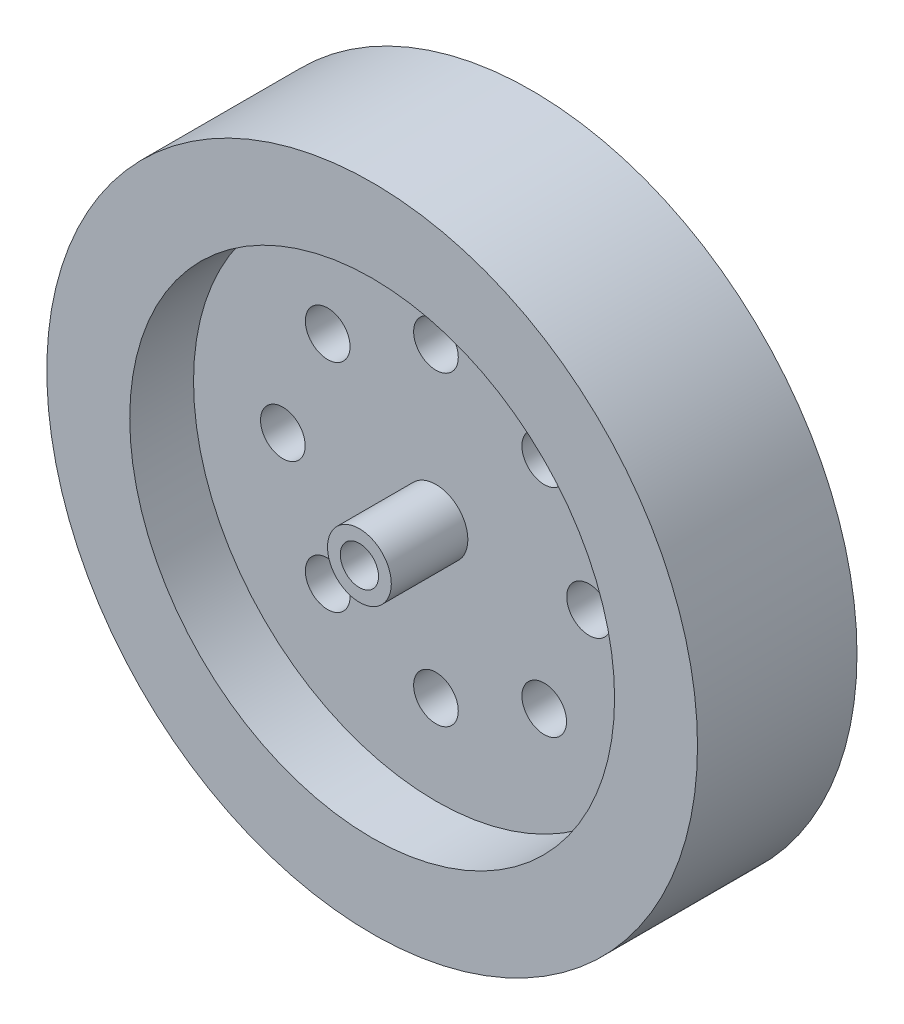
ISO-10303-21;
HEADER;
FILE_DESCRIPTION(('STEP AP214'),'2;1');
FILE_NAME('part.step','',(''),(''),'','','');
FILE_SCHEMA(('AUTOMOTIVE_DESIGN { 1 0 10303 214 1 1 1 1 }'));
ENDSEC;
DATA;
#1=APPLICATION_CONTEXT('core data for automotive mechanical design processes');
#2=APPLICATION_PROTOCOL_DEFINITION('international standard','automotive_design',2000,#1);
#3=PRODUCT_CONTEXT('',#1,'mechanical');
#4=PRODUCT('Part','Part','',(#3));
#5=PRODUCT_RELATED_PRODUCT_CATEGORY('part','',(#4));
#6=PRODUCT_DEFINITION_FORMATION('','',#4);
#7=PRODUCT_DEFINITION_CONTEXT('part definition',#1,'design');
#8=PRODUCT_DEFINITION('design','',#6,#7);
#9=PRODUCT_DEFINITION_SHAPE('','',#8);
#10=(LENGTH_UNIT() NAMED_UNIT(*) SI_UNIT(.MILLI.,.METRE.));
#11=(NAMED_UNIT(*) PLANE_ANGLE_UNIT() SI_UNIT($,.RADIAN.));
#12=(NAMED_UNIT(*) SI_UNIT($,.STERADIAN.) SOLID_ANGLE_UNIT());
#13=UNCERTAINTY_MEASURE_WITH_UNIT(LENGTH_MEASURE(1.E-05),#10,'distance_accuracy_value','');
#14=(GEOMETRIC_REPRESENTATION_CONTEXT(3) GLOBAL_UNCERTAINTY_ASSIGNED_CONTEXT((#13)) GLOBAL_UNIT_ASSIGNED_CONTEXT((#10,
#11,#12)) REPRESENTATION_CONTEXT('',''));
#15=CARTESIAN_POINT('',(0.,0.,0.));
#16=DIRECTION('',(0.,0.,1.));
#17=DIRECTION('',(1.,0.,0.));
#18=AXIS2_PLACEMENT_3D('',#15,#16,#17);
#19=CARTESIAN_POINT('',(-16.9705627484765,16.9705627484757,-25.));
#20=DIRECTION('',(0.,0.,1.));
#21=DIRECTION('',(1.,0.,0.));
#22=AXIS2_PLACEMENT_3D('',#19,#20,#21);
#23=CYLINDRICAL_SURFACE('',#22,3.50000000000128);
#24=CARTESIAN_POINT('',(-16.9705627484765,16.9705627484757,-15.));
#25=DIRECTION('',(0.,0.,1.));
#26=DIRECTION('',(1.,0.,0.));
#27=AXIS2_PLACEMENT_3D('',#24,#25,#26);
#28=CIRCLE('',#27,3.50000000000128);
#29=CARTESIAN_POINT('',(-13.4705627484753,16.9705627484757,-15.));
#30=VERTEX_POINT('',#29);
#31=EDGE_CURVE('E81',#30,#30,#28,.F.);
#32=ORIENTED_EDGE('',*,*,#31,.T.);
#33=EDGE_LOOP('',(#32));
#34=FACE_BOUND('',#33,.T.);
#35=CARTESIAN_POINT('',(-16.9705627484765,16.9705627484757,-10.));
#36=DIRECTION('',(0.,0.,1.));
#37=DIRECTION('',(1.,0.,0.));
#38=AXIS2_PLACEMENT_3D('',#35,#36,#37);
#39=CIRCLE('',#38,3.50000000000128);
#40=CARTESIAN_POINT('',(-13.4705627484753,16.9705627484757,-10.));
#41=VERTEX_POINT('',#40);
#42=EDGE_CURVE('E58',#41,#41,#39,.F.);
#43=ORIENTED_EDGE('',*,*,#42,.F.);
#44=EDGE_LOOP('',(#43));
#45=FACE_BOUND('',#44,.T.);
#46=ADVANCED_FACE('F43',(#34,#45),#23,.F.);
#47=CARTESIAN_POINT('',(0.,24.,-25.));
#48=DIRECTION('',(0.,0.,1.));
#49=DIRECTION('',(1.,0.,0.));
#50=AXIS2_PLACEMENT_3D('',#47,#48,#49);
#51=CYLINDRICAL_SURFACE('',#50,3.5);
#52=CARTESIAN_POINT('',(0.,24.,-15.));
#53=DIRECTION('',(0.,0.,1.));
#54=DIRECTION('',(1.,0.,0.));
#55=AXIS2_PLACEMENT_3D('',#52,#53,#54);
#56=CIRCLE('',#55,3.5);
#57=CARTESIAN_POINT('',(3.5,24.,-15.));
#58=VERTEX_POINT('',#57);
#59=EDGE_CURVE('E218',#58,#58,#56,.F.);
#60=ORIENTED_EDGE('',*,*,#59,.T.);
#61=EDGE_LOOP('',(#60));
#62=FACE_BOUND('',#61,.T.);
#63=CARTESIAN_POINT('',(0.,24.,-10.));
#64=DIRECTION('',(0.,0.,1.));
#65=DIRECTION('',(1.,0.,0.));
#66=AXIS2_PLACEMENT_3D('',#63,#64,#65);
#67=CIRCLE('',#66,3.5);
#68=CARTESIAN_POINT('',(3.5,24.,-10.));
#69=VERTEX_POINT('',#68);
#70=EDGE_CURVE('E100',#69,#69,#67,.F.);
#71=ORIENTED_EDGE('',*,*,#70,.F.);
#72=EDGE_LOOP('',(#71));
#73=FACE_BOUND('',#72,.T.);
#74=ADVANCED_FACE('F112',(#62,#73),#51,.F.);
#75=CARTESIAN_POINT('',(16.9705627484777,16.9705627484786,-25.));
#76=DIRECTION('',(0.,0.,1.));
#77=DIRECTION('',(1.,0.,0.));
#78=AXIS2_PLACEMENT_3D('',#75,#76,#77);
#79=CYLINDRICAL_SURFACE('',#78,3.50000000000019);
#80=CARTESIAN_POINT('',(16.9705627484777,16.9705627484786,-15.));
#81=DIRECTION('',(0.,0.,1.));
#82=DIRECTION('',(1.,0.,0.));
#83=AXIS2_PLACEMENT_3D('',#80,#81,#82);
#84=CIRCLE('',#83,3.50000000000019);
#85=CARTESIAN_POINT('',(20.4705627484779,16.9705627484786,-15.));
#86=VERTEX_POINT('',#85);
#87=EDGE_CURVE('E215',#86,#86,#84,.F.);
#88=ORIENTED_EDGE('',*,*,#87,.T.);
#89=EDGE_LOOP('',(#88));
#90=FACE_BOUND('',#89,.T.);
#91=CARTESIAN_POINT('',(16.9705627484777,16.9705627484786,-10.));
#92=DIRECTION('',(0.,0.,1.));
#93=DIRECTION('',(1.,0.,0.));
#94=AXIS2_PLACEMENT_3D('',#91,#92,#93);
#95=CIRCLE('',#94,3.50000000000019);
#96=CARTESIAN_POINT('',(20.4705627484779,16.9705627484786,-10.));
#97=VERTEX_POINT('',#96);
#98=EDGE_CURVE('E97',#97,#97,#95,.F.);
#99=ORIENTED_EDGE('',*,*,#98,.F.);
#100=EDGE_LOOP('',(#99));
#101=FACE_BOUND('',#100,.T.);
#102=ADVANCED_FACE('F118',(#90,#101),#79,.F.);
#103=CARTESIAN_POINT('',(24.000000000002,2.04195435051216E-12,-25.));
#104=DIRECTION('',(0.,0.,1.));
#105=DIRECTION('',(1.,0.,0.));
#106=AXIS2_PLACEMENT_3D('',#103,#104,#105);
#107=CYLINDRICAL_SURFACE('',#106,3.50000000000144);
#108=CARTESIAN_POINT('',(24.000000000002,2.04195435051216E-12,-15.));
#109=DIRECTION('',(0.,0.,1.));
#110=DIRECTION('',(1.,0.,0.));
#111=AXIS2_PLACEMENT_3D('',#108,#109,#110);
#112=CIRCLE('',#111,3.50000000000144);
#113=CARTESIAN_POINT('',(27.5000000000035,2.04195435051216E-12,-15.));
#114=VERTEX_POINT('',#113);
#115=EDGE_CURVE('E211',#114,#114,#112,.F.);
#116=ORIENTED_EDGE('',*,*,#115,.T.);
#117=EDGE_LOOP('',(#116));
#118=FACE_BOUND('',#117,.T.);
#119=CARTESIAN_POINT('',(24.000000000002,2.04195435051216E-12,-10.));
#120=DIRECTION('',(0.,0.,1.));
#121=DIRECTION('',(1.,0.,0.));
#122=AXIS2_PLACEMENT_3D('',#119,#120,#121);
#123=CIRCLE('',#122,3.50000000000144);
#124=CARTESIAN_POINT('',(27.5000000000035,2.04195435051216E-12,-10.));
#125=VERTEX_POINT('',#124);
#126=EDGE_CURVE('E93',#125,#125,#123,.F.);
#127=ORIENTED_EDGE('',*,*,#126,.F.);
#128=EDGE_LOOP('',(#127));
#129=FACE_BOUND('',#128,.T.);
#130=ADVANCED_FACE('F128',(#118,#129),#107,.F.);
#131=CARTESIAN_POINT('',(16.9705627484806,-16.9705627484757,-25.));
#132=DIRECTION('',(0.,0.,1.));
#133=DIRECTION('',(1.,0.,0.));
#134=AXIS2_PLACEMENT_3D('',#131,#132,#133);
#135=CYLINDRICAL_SURFACE('',#134,3.50000000000304);
#136=CARTESIAN_POINT('',(16.9705627484806,-16.9705627484757,-15.));
#137=DIRECTION('',(0.,0.,1.));
#138=DIRECTION('',(1.,0.,0.));
#139=AXIS2_PLACEMENT_3D('',#136,#137,#138);
#140=CIRCLE('',#139,3.50000000000304);
#141=CARTESIAN_POINT('',(20.4705627484837,-16.9705627484757,-15.));
#142=VERTEX_POINT('',#141);
#143=EDGE_CURVE('E202',#142,#142,#140,.F.);
#144=ORIENTED_EDGE('',*,*,#143,.T.);
#145=EDGE_LOOP('',(#144));
#146=FACE_BOUND('',#145,.T.);
#147=CARTESIAN_POINT('',(16.9705627484806,-16.9705627484757,-10.));
#148=DIRECTION('',(0.,0.,1.));
#149=DIRECTION('',(1.,0.,0.));
#150=AXIS2_PLACEMENT_3D('',#147,#148,#149);
#151=CIRCLE('',#150,3.50000000000304);
#152=CARTESIAN_POINT('',(20.4705627484837,-16.9705627484757,-10.));
#153=VERTEX_POINT('',#152);
#154=EDGE_CURVE('E89',#153,#153,#151,.F.);
#155=ORIENTED_EDGE('',*,*,#154,.F.);
#156=EDGE_LOOP('',(#155));
#157=FACE_BOUND('',#156,.T.);
#158=ADVANCED_FACE('F132',(#146,#157),#135,.F.);
#159=CARTESIAN_POINT('',(-16.9705627484737,-16.9705627484786,-25.));
#160=DIRECTION('',(0.,0.,1.));
#161=DIRECTION('',(1.,0.,0.));
#162=AXIS2_PLACEMENT_3D('',#159,#160,#161);
#163=CYLINDRICAL_SURFACE('',#162,3.50000000000396);
#164=CARTESIAN_POINT('',(-16.9705627484737,-16.9705627484786,-15.));
#165=DIRECTION('',(0.,0.,1.));
#166=DIRECTION('',(1.,0.,0.));
#167=AXIS2_PLACEMENT_3D('',#164,#165,#166);
#168=CIRCLE('',#167,3.50000000000396);
#169=CARTESIAN_POINT('',(-13.4705627484697,-16.9705627484786,-15.));
#170=VERTEX_POINT('',#169);
#171=EDGE_CURVE('E196',#170,#170,#168,.F.);
#172=ORIENTED_EDGE('',*,*,#171,.T.);
#173=EDGE_LOOP('',(#172));
#174=FACE_BOUND('',#173,.T.);
#175=CARTESIAN_POINT('',(-16.9705627484737,-16.9705627484786,-10.));
#176=DIRECTION('',(0.,0.,1.));
#177=DIRECTION('',(1.,0.,0.));
#178=AXIS2_PLACEMENT_3D('',#175,#176,#177);
#179=CIRCLE('',#178,3.50000000000396);
#180=CARTESIAN_POINT('',(-13.4705627484697,-16.9705627484786,-10.));
#181=VERTEX_POINT('',#180);
#182=EDGE_CURVE('E72',#181,#181,#179,.F.);
#183=ORIENTED_EDGE('',*,*,#182,.F.);
#184=EDGE_LOOP('',(#183));
#185=FACE_BOUND('',#184,.T.);
#186=ADVANCED_FACE('F168',(#174,#185),#163,.F.);
#187=CARTESIAN_POINT('',(-23.999999999998,-2.04489350283011E-12,-25.));
#188=DIRECTION('',(0.,0.,1.));
#189=DIRECTION('',(1.,0.,0.));
#190=AXIS2_PLACEMENT_3D('',#187,#188,#189);
#191=CYLINDRICAL_SURFACE('',#190,3.50000000000279);
#192=CARTESIAN_POINT('',(-23.999999999998,-2.04489350283011E-12,-15.));
#193=DIRECTION('',(0.,0.,1.));
#194=DIRECTION('',(1.,0.,0.));
#195=AXIS2_PLACEMENT_3D('',#192,#193,#194);
#196=CIRCLE('',#195,3.50000000000279);
#197=CARTESIAN_POINT('',(-20.4999999999952,-2.04489350283011E-12,-15.));
#198=VERTEX_POINT('',#197);
#199=EDGE_CURVE('E179',#198,#198,#196,.F.);
#200=ORIENTED_EDGE('',*,*,#199,.T.);
#201=EDGE_LOOP('',(#200));
#202=FACE_BOUND('',#201,.T.);
#203=CARTESIAN_POINT('',(-23.999999999998,-2.04489350283011E-12,-10.));
#204=DIRECTION('',(0.,0.,1.));
#205=DIRECTION('',(1.,0.,0.));
#206=AXIS2_PLACEMENT_3D('',#203,#204,#205);
#207=CIRCLE('',#206,3.50000000000279);
#208=CARTESIAN_POINT('',(-20.4999999999952,-2.04489350283011E-12,-10.));
#209=VERTEX_POINT('',#208);
#210=EDGE_CURVE('E65',#209,#209,#207,.F.);
#211=ORIENTED_EDGE('',*,*,#210,.F.);
#212=EDGE_LOOP('',(#211));
#213=FACE_BOUND('',#212,.T.);
#214=ADVANCED_FACE('F160',(#202,#213),#191,.F.);
#215=CARTESIAN_POINT('',(0.,0.,-25.));
#216=DIRECTION('',(0.,0.,1.));
#217=DIRECTION('',(1.,0.,0.));
#218=AXIS2_PLACEMENT_3D('',#215,#216,#217);
#219=CYLINDRICAL_SURFACE('',#218,3.);
#220=CARTESIAN_POINT('',(0.,0.,-15.));
#221=DIRECTION('',(0.,0.,1.));
#222=DIRECTION('',(1.,0.,0.));
#223=AXIS2_PLACEMENT_3D('',#220,#221,#222);
#224=CIRCLE('',#223,3.);
#225=CARTESIAN_POINT('',(3.,0.,-15.));
#226=VERTEX_POINT('',#225);
#227=EDGE_CURVE('E197',#226,#226,#224,.F.);
#228=ORIENTED_EDGE('',*,*,#227,.T.);
#229=EDGE_LOOP('',(#228));
#230=FACE_BOUND('',#229,.T.);
#231=CARTESIAN_POINT('',(0.,0.,2.));
#232=DIRECTION('',(0.,0.,1.));
#233=DIRECTION('',(1.,0.,0.));
#234=AXIS2_PLACEMENT_3D('',#231,#232,#233);
#235=CIRCLE('',#234,3.);
#236=CARTESIAN_POINT('',(3.,0.,2.));
#237=VERTEX_POINT('',#236);
#238=EDGE_CURVE('E251',#237,#237,#235,.F.);
#239=ORIENTED_EDGE('',*,*,#238,.F.);
#240=EDGE_LOOP('',(#239));
#241=FACE_BOUND('',#240,.T.);
#242=ADVANCED_FACE('F123',(#230,#241),#219,.F.);
#243=CARTESIAN_POINT('',(4.08390870102432E-12,-24.,-25.));
#244=DIRECTION('',(0.,0.,1.));
#245=DIRECTION('',(1.,0.,0.));
#246=AXIS2_PLACEMENT_3D('',#243,#244,#245);
#247=CYLINDRICAL_SURFACE('',#246,3.50000000000407);
#248=CARTESIAN_POINT('',(4.08390870102432E-12,-24.,-15.));
#249=DIRECTION('',(0.,0.,1.));
#250=DIRECTION('',(1.,0.,0.));
#251=AXIS2_PLACEMENT_3D('',#248,#249,#250);
#252=CIRCLE('',#251,3.50000000000407);
#253=CARTESIAN_POINT('',(3.50000000000815,-24.,-15.));
#254=VERTEX_POINT('',#253);
#255=EDGE_CURVE('E47',#254,#254,#252,.F.);
#256=ORIENTED_EDGE('',*,*,#255,.T.);
#257=EDGE_LOOP('',(#256));
#258=FACE_BOUND('',#257,.T.);
#259=CARTESIAN_POINT('',(4.08390870102432E-12,-24.,-10.));
#260=DIRECTION('',(0.,0.,1.));
#261=DIRECTION('',(1.,0.,0.));
#262=AXIS2_PLACEMENT_3D('',#259,#260,#261);
#263=CIRCLE('',#262,3.50000000000407);
#264=CARTESIAN_POINT('',(3.50000000000815,-24.,-10.));
#265=VERTEX_POINT('',#264);
#266=EDGE_CURVE('E62',#265,#265,#263,.F.);
#267=ORIENTED_EDGE('',*,*,#266,.F.);
#268=EDGE_LOOP('',(#267));
#269=FACE_BOUND('',#268,.T.);
#270=ADVANCED_FACE('F151',(#258,#269),#247,.F.);
#271=CARTESIAN_POINT('',(0.,0.,-25.));
#272=DIRECTION('',(0.,0.,1.));
#273=DIRECTION('',(1.,0.,0.));
#274=AXIS2_PLACEMENT_3D('',#271,#272,#273);
#275=CYLINDRICAL_SURFACE('',#274,51.);
#276=CARTESIAN_POINT('',(0.,0.,-25.));
#277=DIRECTION('',(0.,0.,1.));
#278=DIRECTION('',(1.,0.,0.));
#279=AXIS2_PLACEMENT_3D('',#276,#277,#278);
#280=CIRCLE('',#279,51.);
#281=CARTESIAN_POINT('',(51.,0.,-25.));
#282=VERTEX_POINT('',#281);
#283=EDGE_CURVE('E11',#282,#282,#280,.T.);
#284=ORIENTED_EDGE('',*,*,#283,.T.);
#285=EDGE_LOOP('',(#284));
#286=FACE_BOUND('',#285,.T.);
#287=CARTESIAN_POINT('',(0.,0.,0.));
#288=DIRECTION('',(0.,0.,1.));
#289=DIRECTION('',(1.,0.,0.));
#290=AXIS2_PLACEMENT_3D('',#287,#288,#289);
#291=CIRCLE('',#290,51.);
#292=CARTESIAN_POINT('',(51.,0.,0.));
#293=VERTEX_POINT('',#292);
#294=EDGE_CURVE('E52',#293,#293,#291,.T.);
#295=ORIENTED_EDGE('',*,*,#294,.F.);
#296=EDGE_LOOP('',(#295));
#297=FACE_BOUND('',#296,.T.);
#298=ADVANCED_FACE('F45',(#286,#297),#275,.T.);
#299=CARTESIAN_POINT('',(0.,0.,-25.));
#300=DIRECTION('',(0.,0.,1.));
#301=DIRECTION('',(1.,0.,0.));
#302=AXIS2_PLACEMENT_3D('',#299,#300,#301);
#303=PLANE('',#302);
#304=CARTESIAN_POINT('',(0.,0.,-25.));
#305=DIRECTION('',(0.,0.,1.));
#306=DIRECTION('',(1.,0.,0.));
#307=AXIS2_PLACEMENT_3D('',#304,#305,#306);
#308=CIRCLE('',#307,38.);
#309=CARTESIAN_POINT('',(38.,0.,-25.));
#310=VERTEX_POINT('',#309);
#311=EDGE_CURVE('E256',#310,#310,#308,.T.);
#312=ORIENTED_EDGE('',*,*,#311,.T.);
#313=EDGE_LOOP('',(#312));
#314=FACE_BOUND('',#313,.T.);
#315=ORIENTED_EDGE('',*,*,#283,.F.);
#316=EDGE_LOOP('',(#315));
#317=FACE_BOUND('',#316,.T.);
#318=ADVANCED_FACE('F134',(#314,#317),#303,.F.);
#319=CARTESIAN_POINT('',(0.,0.,0.));
#320=DIRECTION('',(0.,0.,1.));
#321=DIRECTION('',(1.,0.,0.));
#322=AXIS2_PLACEMENT_3D('',#319,#320,#321);
#323=PLANE('',#322);
#324=CARTESIAN_POINT('',(0.,0.,0.));
#325=DIRECTION('',(0.,0.,1.));
#326=DIRECTION('',(1.,0.,0.));
#327=AXIS2_PLACEMENT_3D('',#324,#325,#326);
#328=CIRCLE('',#327,38.);
#329=CARTESIAN_POINT('',(38.,0.,0.));
#330=VERTEX_POINT('',#329);
#331=EDGE_CURVE('E75',#330,#330,#328,.T.);
#332=ORIENTED_EDGE('',*,*,#331,.F.);
#333=EDGE_LOOP('',(#332));
#334=FACE_BOUND('',#333,.T.);
#335=ORIENTED_EDGE('',*,*,#294,.T.);
#336=EDGE_LOOP('',(#335));
#337=FACE_BOUND('',#336,.T.);
#338=ADVANCED_FACE('F136',(#334,#337),#323,.T.);
#339=CARTESIAN_POINT('',(0.,0.,-10.));
#340=DIRECTION('',(0.,0.,1.));
#341=DIRECTION('',(1.,0.,0.));
#342=AXIS2_PLACEMENT_3D('',#339,#340,#341);
#343=PLANE('',#342);
#344=CARTESIAN_POINT('',(0.,0.,-10.));
#345=DIRECTION('',(0.,0.,1.));
#346=DIRECTION('',(1.,0.,0.));
#347=AXIS2_PLACEMENT_3D('',#344,#345,#346);
#348=CIRCLE('',#347,5.);
#349=CARTESIAN_POINT('',(5.,0.,-10.));
#350=VERTEX_POINT('',#349);
#351=EDGE_CURVE('E262',#350,#350,#348,.T.);
#352=ORIENTED_EDGE('',*,*,#351,.F.);
#353=EDGE_LOOP('',(#352));
#354=FACE_BOUND('',#353,.T.);
#355=CARTESIAN_POINT('',(0.,0.,-10.));
#356=DIRECTION('',(0.,0.,1.));
#357=DIRECTION('',(1.,0.,0.));
#358=AXIS2_PLACEMENT_3D('',#355,#356,#357);
#359=CIRCLE('',#358,38.);
#360=CARTESIAN_POINT('',(38.,0.,-10.));
#361=VERTEX_POINT('',#360);
#362=EDGE_CURVE('E66',#361,#361,#359,.T.);
#363=ORIENTED_EDGE('',*,*,#362,.T.);
#364=EDGE_LOOP('',(#363));
#365=FACE_BOUND('',#364,.T.);
#366=ORIENTED_EDGE('',*,*,#266,.T.);
#367=EDGE_LOOP('',(#366));
#368=FACE_BOUND('',#367,.T.);
#369=ORIENTED_EDGE('',*,*,#210,.T.);
#370=EDGE_LOOP('',(#369));
#371=FACE_BOUND('',#370,.T.);
#372=ORIENTED_EDGE('',*,*,#182,.T.);
#373=EDGE_LOOP('',(#372));
#374=FACE_BOUND('',#373,.T.);
#375=ORIENTED_EDGE('',*,*,#154,.T.);
#376=EDGE_LOOP('',(#375));
#377=FACE_BOUND('',#376,.T.);
#378=ORIENTED_EDGE('',*,*,#126,.T.);
#379=EDGE_LOOP('',(#378));
#380=FACE_BOUND('',#379,.T.);
#381=ORIENTED_EDGE('',*,*,#98,.T.);
#382=EDGE_LOOP('',(#381));
#383=FACE_BOUND('',#382,.T.);
#384=ORIENTED_EDGE('',*,*,#70,.T.);
#385=EDGE_LOOP('',(#384));
#386=FACE_BOUND('',#385,.T.);
#387=ORIENTED_EDGE('',*,*,#42,.T.);
#388=EDGE_LOOP('',(#387));
#389=FACE_BOUND('',#388,.T.);
#390=ADVANCED_FACE('F109',(#354,#365,#368,#371,#374,#377,#380,#383,#386,#389),#343,.T.);
#391=CARTESIAN_POINT('',(0.,0.,-10.));
#392=DIRECTION('',(0.,0.,1.));
#393=DIRECTION('',(1.,0.,0.));
#394=AXIS2_PLACEMENT_3D('',#391,#392,#393);
#395=CYLINDRICAL_SURFACE('',#394,38.);
#396=ORIENTED_EDGE('',*,*,#362,.F.);
#397=EDGE_LOOP('',(#396));
#398=FACE_BOUND('',#397,.T.);
#399=ORIENTED_EDGE('',*,*,#331,.T.);
#400=EDGE_LOOP('',(#399));
#401=FACE_BOUND('',#400,.T.);
#402=ADVANCED_FACE('F143',(#398,#401),#395,.F.);
#403=CARTESIAN_POINT('',(0.,0.,-15.));
#404=DIRECTION('',(0.,0.,1.));
#405=DIRECTION('',(1.,0.,0.));
#406=AXIS2_PLACEMENT_3D('',#403,#404,#405);
#407=PLANE('',#406);
#408=ORIENTED_EDGE('',*,*,#59,.F.);
#409=EDGE_LOOP('',(#408));
#410=FACE_BOUND('',#409,.T.);
#411=ORIENTED_EDGE('',*,*,#115,.F.);
#412=EDGE_LOOP('',(#411));
#413=FACE_BOUND('',#412,.T.);
#414=ORIENTED_EDGE('',*,*,#171,.F.);
#415=EDGE_LOOP('',(#414));
#416=FACE_BOUND('',#415,.T.);
#417=ORIENTED_EDGE('',*,*,#227,.F.);
#418=EDGE_LOOP('',(#417));
#419=FACE_BOUND('',#418,.T.);
#420=CARTESIAN_POINT('',(0.,0.,-15.));
#421=DIRECTION('',(0.,0.,1.));
#422=DIRECTION('',(1.,0.,0.));
#423=AXIS2_PLACEMENT_3D('',#420,#421,#422);
#424=CIRCLE('',#423,38.);
#425=CARTESIAN_POINT('',(38.,0.,-15.));
#426=VERTEX_POINT('',#425);
#427=EDGE_CURVE('E261',#426,#426,#424,.T.);
#428=ORIENTED_EDGE('',*,*,#427,.F.);
#429=EDGE_LOOP('',(#428));
#430=FACE_BOUND('',#429,.T.);
#431=ORIENTED_EDGE('',*,*,#255,.F.);
#432=EDGE_LOOP('',(#431));
#433=FACE_BOUND('',#432,.T.);
#434=ORIENTED_EDGE('',*,*,#199,.F.);
#435=EDGE_LOOP('',(#434));
#436=FACE_BOUND('',#435,.T.);
#437=ORIENTED_EDGE('',*,*,#143,.F.);
#438=EDGE_LOOP('',(#437));
#439=FACE_BOUND('',#438,.T.);
#440=ORIENTED_EDGE('',*,*,#87,.F.);
#441=EDGE_LOOP('',(#440));
#442=FACE_BOUND('',#441,.T.);
#443=ORIENTED_EDGE('',*,*,#31,.F.);
#444=EDGE_LOOP('',(#443));
#445=FACE_BOUND('',#444,.T.);
#446=ADVANCED_FACE('F225',(#410,#413,#416,#419,#430,#433,#436,#439,#442,#445),#407,.F.);
#447=CARTESIAN_POINT('',(0.,0.,-15.));
#448=DIRECTION('',(0.,0.,-1.));
#449=DIRECTION('',(-1.,0.,0.));
#450=AXIS2_PLACEMENT_3D('',#447,#448,#449);
#451=CYLINDRICAL_SURFACE('',#450,38.);
#452=ORIENTED_EDGE('',*,*,#427,.T.);
#453=EDGE_LOOP('',(#452));
#454=FACE_BOUND('',#453,.T.);
#455=ORIENTED_EDGE('',*,*,#311,.F.);
#456=EDGE_LOOP('',(#455));
#457=FACE_BOUND('',#456,.T.);
#458=ADVANCED_FACE('F227',(#454,#457),#451,.F.);
#459=CARTESIAN_POINT('',(0.,0.,2.));
#460=DIRECTION('',(0.,0.,-1.));
#461=DIRECTION('',(-1.,0.,0.));
#462=AXIS2_PLACEMENT_3D('',#459,#460,#461);
#463=CYLINDRICAL_SURFACE('',#462,5.);
#464=CARTESIAN_POINT('',(0.,0.,2.));
#465=DIRECTION('',(0.,0.,1.));
#466=DIRECTION('',(1.,0.,0.));
#467=AXIS2_PLACEMENT_3D('',#464,#465,#466);
#468=CIRCLE('',#467,5.);
#469=CARTESIAN_POINT('',(5.,0.,2.));
#470=VERTEX_POINT('',#469);
#471=EDGE_CURVE('E254',#470,#470,#468,.T.);
#472=ORIENTED_EDGE('',*,*,#471,.F.);
#473=EDGE_LOOP('',(#472));
#474=FACE_BOUND('',#473,.T.);
#475=ORIENTED_EDGE('',*,*,#351,.T.);
#476=EDGE_LOOP('',(#475));
#477=FACE_BOUND('',#476,.T.);
#478=ADVANCED_FACE('F234',(#474,#477),#463,.T.);
#479=CARTESIAN_POINT('',(0.,0.,2.));
#480=DIRECTION('',(0.,0.,1.));
#481=DIRECTION('',(1.,0.,0.));
#482=AXIS2_PLACEMENT_3D('',#479,#480,#481);
#483=PLANE('',#482);
#484=ORIENTED_EDGE('',*,*,#238,.T.);
#485=EDGE_LOOP('',(#484));
#486=FACE_BOUND('',#485,.T.);
#487=ORIENTED_EDGE('',*,*,#471,.T.);
#488=EDGE_LOOP('',(#487));
#489=FACE_BOUND('',#488,.T.);
#490=ADVANCED_FACE('F242',(#486,#489),#483,.T.);
#491=CLOSED_SHELL('',(#46,#74,#102,#130,#158,#186,#214,#242,#270,#298,#318,#338,#390,#402,#446,
#458,#478,#490));
#492=MANIFOLD_SOLID_BREP('B2',#491);
#493=ADVANCED_BREP_SHAPE_REPRESENTATION('',(#18,#492),#14);
#494=SHAPE_DEFINITION_REPRESENTATION(#9,#493);
ENDSEC;
END-ISO-10303-21;
